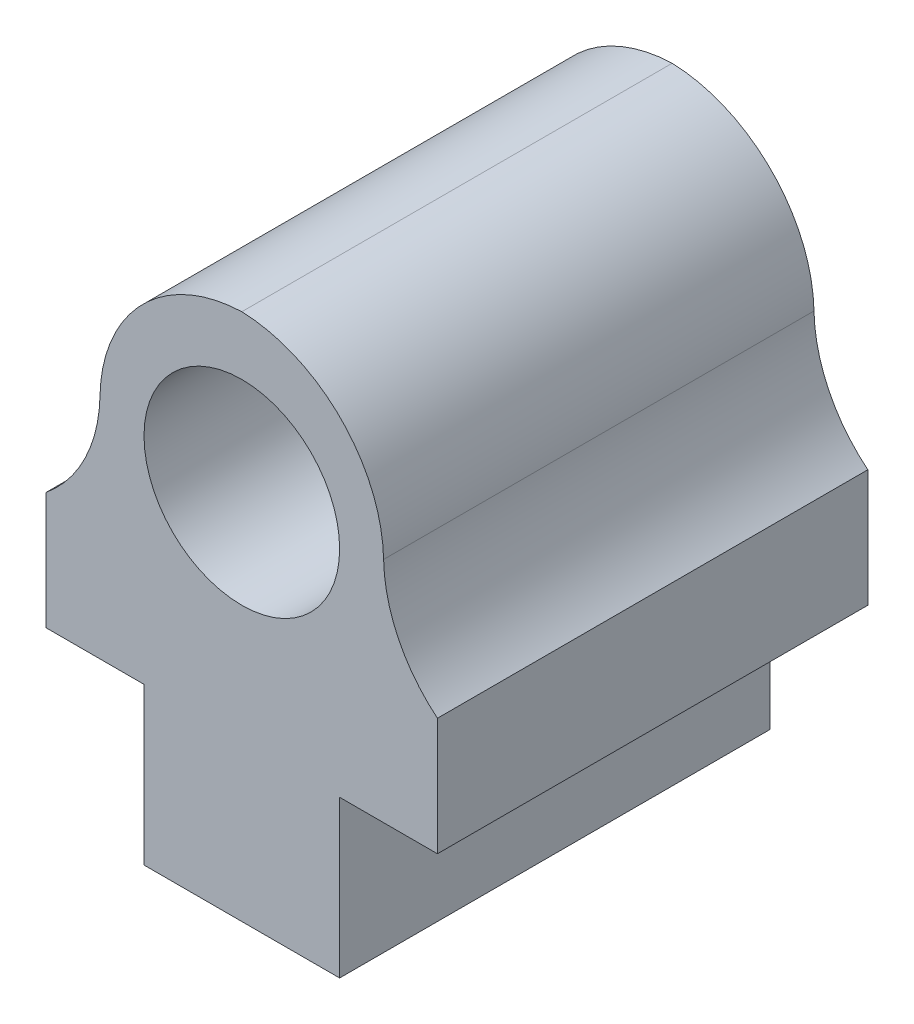
ISO-10303-21;
HEADER;
FILE_DESCRIPTION(('STEP AP214'),'2;1');
FILE_NAME('part.step','',(''),(''),'','','');
FILE_SCHEMA(('AUTOMOTIVE_DESIGN { 1 0 10303 214 1 1 1 1 }'));
ENDSEC;
DATA;
#1=APPLICATION_CONTEXT('core data for automotive mechanical design processes');
#2=APPLICATION_PROTOCOL_DEFINITION('international standard','automotive_design',2000,#1);
#3=PRODUCT_CONTEXT('',#1,'mechanical');
#4=PRODUCT('Part','Part','',(#3));
#5=PRODUCT_RELATED_PRODUCT_CATEGORY('part','',(#4));
#6=PRODUCT_DEFINITION_FORMATION('','',#4);
#7=PRODUCT_DEFINITION_CONTEXT('part definition',#1,'design');
#8=PRODUCT_DEFINITION('design','',#6,#7);
#9=PRODUCT_DEFINITION_SHAPE('','',#8);
#10=(LENGTH_UNIT() NAMED_UNIT(*) SI_UNIT(.MILLI.,.METRE.));
#11=(NAMED_UNIT(*) PLANE_ANGLE_UNIT() SI_UNIT($,.RADIAN.));
#12=(NAMED_UNIT(*) SI_UNIT($,.STERADIAN.) SOLID_ANGLE_UNIT());
#13=UNCERTAINTY_MEASURE_WITH_UNIT(LENGTH_MEASURE(1.E-05),#10,'distance_accuracy_value','');
#14=(GEOMETRIC_REPRESENTATION_CONTEXT(3) GLOBAL_UNCERTAINTY_ASSIGNED_CONTEXT((#13)) GLOBAL_UNIT_ASSIGNED_CONTEXT((#10,
#11,#12)) REPRESENTATION_CONTEXT('',''));
#15=CARTESIAN_POINT('',(0.,0.,0.));
#16=DIRECTION('',(0.,0.,1.));
#17=DIRECTION('',(1.,0.,0.));
#18=AXIS2_PLACEMENT_3D('',#15,#16,#17);
#19=CARTESIAN_POINT('',(0.,0.,0.));
#20=DIRECTION('',(0.,-1.,0.));
#21=DIRECTION('',(0.,0.,-1.));
#22=AXIS2_PLACEMENT_3D('',#19,#20,#21);
#23=PLANE('',#22);
#24=DIRECTION('',(0.,0.,-1.));
#25=VECTOR('',#24,1.);
#26=CARTESIAN_POINT('',(5.,0.,0.));
#27=LINE('',#26,#25);
#28=CARTESIAN_POINT('',(5.,0.,0.));
#29=VERTEX_POINT('',#28);
#30=CARTESIAN_POINT('',(5.,0.,-22.));
#31=VERTEX_POINT('',#30);
#32=EDGE_CURVE('E141',#29,#31,#27,.T.);
#33=ORIENTED_EDGE('',*,*,#32,.F.);
#34=DIRECTION('',(1.,0.,0.));
#35=VECTOR('',#34,1.);
#36=CARTESIAN_POINT('',(0.,0.,0.));
#37=LINE('',#36,#35);
#38=CARTESIAN_POINT('',(0.,0.,0.));
#39=VERTEX_POINT('',#38);
#40=EDGE_CURVE('E158',#39,#29,#37,.T.);
#41=ORIENTED_EDGE('',*,*,#40,.F.);
#42=DIRECTION('',(0.,0.,1.));
#43=VECTOR('',#42,1.);
#44=CARTESIAN_POINT('',(0.,0.,0.));
#45=LINE('',#44,#43);
#46=CARTESIAN_POINT('',(0.,0.,-22.));
#47=VERTEX_POINT('',#46);
#48=EDGE_CURVE('E142',#47,#39,#45,.T.);
#49=ORIENTED_EDGE('',*,*,#48,.F.);
#50=DIRECTION('',(-1.,0.,0.));
#51=VECTOR('',#50,1.);
#52=CARTESIAN_POINT('',(0.,0.,-22.));
#53=LINE('',#52,#51);
#54=EDGE_CURVE('E163',#31,#47,#53,.T.);
#55=ORIENTED_EDGE('',*,*,#54,.F.);
#56=EDGE_LOOP('',(#33,#41,#49,#55));
#57=FACE_BOUND('',#56,.T.);
#58=ADVANCED_FACE('F37',(#57),#23,.T.);
#59=CARTESIAN_POINT('',(0.,6.,0.));
#60=DIRECTION('',(1.,0.,0.));
#61=DIRECTION('',(0.,0.,-1.));
#62=AXIS2_PLACEMENT_3D('',#59,#60,#61);
#63=PLANE('',#62);
#64=ORIENTED_EDGE('',*,*,#48,.T.);
#65=DIRECTION('',(0.,-1.,0.));
#66=VECTOR('',#65,1.);
#67=CARTESIAN_POINT('',(0.,6.,0.));
#68=LINE('',#67,#66);
#69=CARTESIAN_POINT('',(0.,6.,0.));
#70=VERTEX_POINT('',#69);
#71=EDGE_CURVE('E173',#70,#39,#68,.T.);
#72=ORIENTED_EDGE('',*,*,#71,.F.);
#73=DIRECTION('',(0.,0.,1.));
#74=VECTOR('',#73,1.);
#75=CARTESIAN_POINT('',(0.,6.,0.));
#76=LINE('',#75,#74);
#77=CARTESIAN_POINT('',(0.,6.,-22.));
#78=VERTEX_POINT('',#77);
#79=EDGE_CURVE('E151',#78,#70,#76,.T.);
#80=ORIENTED_EDGE('',*,*,#79,.F.);
#81=DIRECTION('',(0.,-1.,0.));
#82=VECTOR('',#81,1.);
#83=CARTESIAN_POINT('',(0.,6.,-22.));
#84=LINE('',#83,#82);
#85=EDGE_CURVE('E156',#78,#47,#84,.T.);
#86=ORIENTED_EDGE('',*,*,#85,.T.);
#87=EDGE_LOOP('',(#64,#72,#80,#86));
#88=FACE_BOUND('',#87,.T.);
#89=ADVANCED_FACE('F204',(#88),#63,.F.);
#90=CARTESIAN_POINT('',(0.,6.,0.));
#91=DIRECTION('',(0.,0.,-1.));
#92=DIRECTION('',(-1.,0.,0.));
#93=AXIS2_PLACEMENT_3D('',#90,#91,#92);
#94=PLANE('',#93);
#95=CARTESIAN_POINT('',(10.,11.,0.));
#96=DIRECTION('',(0.,0.,1.));
#97=DIRECTION('',(1.,0.,0.));
#98=AXIS2_PLACEMENT_3D('',#95,#96,#97);
#99=CIRCLE('',#98,5.);
#100=CARTESIAN_POINT('',(15.,11.,0.));
#101=VERTEX_POINT('',#100);
#102=EDGE_CURVE('E190',#101,#101,#99,.T.);
#103=ORIENTED_EDGE('',*,*,#102,.F.);
#104=EDGE_LOOP('',(#103));
#105=FACE_BOUND('',#104,.T.);
#106=DIRECTION('',(0.,-1.,0.));
#107=VECTOR('',#106,1.);
#108=CARTESIAN_POINT('',(20.,6.,0.));
#109=LINE('',#108,#107);
#110=CARTESIAN_POINT('',(20.,6.,0.));
#111=VERTEX_POINT('',#110);
#112=CARTESIAN_POINT('',(20.,0.,0.));
#113=VERTEX_POINT('',#112);
#114=EDGE_CURVE('E170',#111,#113,#109,.T.);
#115=ORIENTED_EDGE('',*,*,#114,.F.);
#116=CARTESIAN_POINT('',(24.7468650433401,11.8066575807702,0.));
#117=DIRECTION('',(0.,0.,-1.));
#118=DIRECTION('',(-1.,0.,0.));
#119=AXIS2_PLACEMENT_3D('',#116,#117,#118);
#120=CIRCLE('',#119,7.5);
#121=CARTESIAN_POINT('',(17.2484325216701,11.6533287903851,0.));
#122=VERTEX_POINT('',#121);
#123=EDGE_CURVE('E197',#111,#122,#120,.T.);
#124=ORIENTED_EDGE('',*,*,#123,.T.);
#125=CARTESIAN_POINT('',(9.75000000000001,11.5,0.));
#126=DIRECTION('',(0.,0.,-1.));
#127=DIRECTION('',(-1.,0.,0.));
#128=AXIS2_PLACEMENT_3D('',#125,#126,#127);
#129=CIRCLE('',#128,7.5);
#130=CARTESIAN_POINT('',(10.,18.9958321752825,0.));
#131=VERTEX_POINT('',#130);
#132=EDGE_CURVE('E184',#122,#131,#129,.F.);
#133=ORIENTED_EDGE('',*,*,#132,.T.);
#134=CARTESIAN_POINT('',(10.25,11.5,0.));
#135=DIRECTION('',(0.,0.,-1.));
#136=DIRECTION('',(-1.,0.,0.));
#137=AXIS2_PLACEMENT_3D('',#134,#135,#136);
#138=CIRCLE('',#137,7.5);
#139=CARTESIAN_POINT('',(2.75156747832995,11.6533287903851,0.));
#140=VERTEX_POINT('',#139);
#141=EDGE_CURVE('E181',#131,#140,#138,.F.);
#142=ORIENTED_EDGE('',*,*,#141,.T.);
#143=CARTESIAN_POINT('',(-4.74686504334009,11.8066575807702,0.));
#144=DIRECTION('',(0.,0.,-1.));
#145=DIRECTION('',(-1.,0.,0.));
#146=AXIS2_PLACEMENT_3D('',#143,#144,#145);
#147=CIRCLE('',#146,7.5);
#148=EDGE_CURVE('E45',#140,#70,#147,.T.);
#149=ORIENTED_EDGE('',*,*,#148,.T.);
#150=ORIENTED_EDGE('',*,*,#71,.T.);
#151=ORIENTED_EDGE('',*,*,#40,.T.);
#152=DIRECTION('',(0.,1.,0.));
#153=VECTOR('',#152,1.);
#154=CARTESIAN_POINT('',(5.,-8.,0.));
#155=LINE('',#154,#153);
#156=CARTESIAN_POINT('',(5.,-8.,0.));
#157=VERTEX_POINT('',#156);
#158=EDGE_CURVE('E234',#157,#29,#155,.T.);
#159=ORIENTED_EDGE('',*,*,#158,.F.);
#160=DIRECTION('',(-1.,0.,0.));
#161=VECTOR('',#160,1.);
#162=CARTESIAN_POINT('',(5.,-8.,0.));
#163=LINE('',#162,#161);
#164=CARTESIAN_POINT('',(15.,-8.,0.));
#165=VERTEX_POINT('',#164);
#166=EDGE_CURVE('E134',#165,#157,#163,.T.);
#167=ORIENTED_EDGE('',*,*,#166,.F.);
#168=DIRECTION('',(0.,1.,0.));
#169=VECTOR('',#168,1.);
#170=CARTESIAN_POINT('',(15.,-8.,0.));
#171=LINE('',#170,#169);
#172=CARTESIAN_POINT('',(15.,0.,0.));
#173=VERTEX_POINT('',#172);
#174=EDGE_CURVE('E147',#165,#173,#171,.T.);
#175=ORIENTED_EDGE('',*,*,#174,.T.);
#176=EDGE_CURVE('E145',#173,#113,#37,.T.);
#177=ORIENTED_EDGE('',*,*,#176,.T.);
#178=EDGE_LOOP('',(#115,#124,#133,#142,#149,#150,#151,#159,#167,#175,#177));
#179=FACE_BOUND('',#178,.T.);
#180=ADVANCED_FACE('F200',(#105,#179),#94,.F.);
#181=CARTESIAN_POINT('',(20.,6.,0.));
#182=DIRECTION('',(-1.,0.,0.));
#183=DIRECTION('',(0.,0.,1.));
#184=AXIS2_PLACEMENT_3D('',#181,#182,#183);
#185=PLANE('',#184);
#186=DIRECTION('',(0.,0.,-1.));
#187=VECTOR('',#186,1.);
#188=CARTESIAN_POINT('',(20.,0.,0.));
#189=LINE('',#188,#187);
#190=CARTESIAN_POINT('',(20.,0.,-22.));
#191=VERTEX_POINT('',#190);
#192=EDGE_CURVE('E161',#113,#191,#189,.T.);
#193=ORIENTED_EDGE('',*,*,#192,.T.);
#194=DIRECTION('',(0.,-1.,0.));
#195=VECTOR('',#194,1.);
#196=CARTESIAN_POINT('',(20.,6.,-22.));
#197=LINE('',#196,#195);
#198=CARTESIAN_POINT('',(20.,6.,-22.));
#199=VERTEX_POINT('',#198);
#200=EDGE_CURVE('E167',#199,#191,#197,.T.);
#201=ORIENTED_EDGE('',*,*,#200,.F.);
#202=DIRECTION('',(0.,0.,-1.));
#203=VECTOR('',#202,1.);
#204=CARTESIAN_POINT('',(20.,6.,0.));
#205=LINE('',#204,#203);
#206=EDGE_CURVE('E153',#111,#199,#205,.T.);
#207=ORIENTED_EDGE('',*,*,#206,.F.);
#208=ORIENTED_EDGE('',*,*,#114,.T.);
#209=EDGE_LOOP('',(#193,#201,#207,#208));
#210=FACE_BOUND('',#209,.T.);
#211=ADVANCED_FACE('F220',(#210),#185,.F.);
#212=CARTESIAN_POINT('',(0.,6.,-22.));
#213=DIRECTION('',(0.,0.,1.));
#214=DIRECTION('',(1.,0.,0.));
#215=AXIS2_PLACEMENT_3D('',#212,#213,#214);
#216=PLANE('',#215);
#217=CARTESIAN_POINT('',(10.,11.,-22.));
#218=DIRECTION('',(0.,0.,1.));
#219=DIRECTION('',(1.,0.,0.));
#220=AXIS2_PLACEMENT_3D('',#217,#218,#219);
#221=CIRCLE('',#220,5.);
#222=CARTESIAN_POINT('',(15.,11.,-22.));
#223=VERTEX_POINT('',#222);
#224=EDGE_CURVE('E230',#223,#223,#221,.T.);
#225=ORIENTED_EDGE('',*,*,#224,.T.);
#226=EDGE_LOOP('',(#225));
#227=FACE_BOUND('',#226,.T.);
#228=ORIENTED_EDGE('',*,*,#85,.F.);
#229=CARTESIAN_POINT('',(-4.7468650433401,11.8066575807702,-22.));
#230=DIRECTION('',(0.,0.,1.));
#231=DIRECTION('',(1.,0.,0.));
#232=AXIS2_PLACEMENT_3D('',#229,#230,#231);
#233=CIRCLE('',#232,7.5);
#234=CARTESIAN_POINT('',(2.75156747832995,11.6533287903851,-22.));
#235=VERTEX_POINT('',#234);
#236=EDGE_CURVE('E11',#78,#235,#233,.T.);
#237=ORIENTED_EDGE('',*,*,#236,.T.);
#238=CARTESIAN_POINT('',(10.25,11.5,-22.));
#239=DIRECTION('',(0.,0.,1.));
#240=DIRECTION('',(1.,0.,0.));
#241=AXIS2_PLACEMENT_3D('',#238,#239,#240);
#242=CIRCLE('',#241,7.5);
#243=CARTESIAN_POINT('',(10.,18.9958321752825,-22.));
#244=VERTEX_POINT('',#243);
#245=EDGE_CURVE('E176',#235,#244,#242,.F.);
#246=ORIENTED_EDGE('',*,*,#245,.T.);
#247=CARTESIAN_POINT('',(9.75,11.5,-22.));
#248=DIRECTION('',(0.,0.,1.));
#249=DIRECTION('',(1.,0.,0.));
#250=AXIS2_PLACEMENT_3D('',#247,#248,#249);
#251=CIRCLE('',#250,7.5);
#252=CARTESIAN_POINT('',(17.24843252167,11.6533287903851,-22.));
#253=VERTEX_POINT('',#252);
#254=EDGE_CURVE('E178',#244,#253,#251,.F.);
#255=ORIENTED_EDGE('',*,*,#254,.T.);
#256=CARTESIAN_POINT('',(24.7468650433401,11.8066575807702,-22.));
#257=DIRECTION('',(0.,0.,1.));
#258=DIRECTION('',(1.,0.,0.));
#259=AXIS2_PLACEMENT_3D('',#256,#257,#258);
#260=CIRCLE('',#259,7.5);
#261=EDGE_CURVE('E195',#253,#199,#260,.T.);
#262=ORIENTED_EDGE('',*,*,#261,.T.);
#263=ORIENTED_EDGE('',*,*,#200,.T.);
#264=CARTESIAN_POINT('',(15.,0.,-22.));
#265=VERTEX_POINT('',#264);
#266=EDGE_CURVE('E154',#191,#265,#53,.T.);
#267=ORIENTED_EDGE('',*,*,#266,.T.);
#268=DIRECTION('',(0.,1.,0.));
#269=VECTOR('',#268,1.);
#270=CARTESIAN_POINT('',(15.,-8.,-22.));
#271=LINE('',#270,#269);
#272=CARTESIAN_POINT('',(15.,-8.,-22.));
#273=VERTEX_POINT('',#272);
#274=EDGE_CURVE('E125',#273,#265,#271,.T.);
#275=ORIENTED_EDGE('',*,*,#274,.F.);
#276=DIRECTION('',(1.,0.,0.));
#277=VECTOR('',#276,1.);
#278=CARTESIAN_POINT('',(5.,-8.,-22.));
#279=LINE('',#278,#277);
#280=CARTESIAN_POINT('',(5.,-8.,-22.));
#281=VERTEX_POINT('',#280);
#282=EDGE_CURVE('E117',#281,#273,#279,.T.);
#283=ORIENTED_EDGE('',*,*,#282,.F.);
#284=DIRECTION('',(0.,1.,0.));
#285=VECTOR('',#284,1.);
#286=CARTESIAN_POINT('',(5.,-8.,-22.));
#287=LINE('',#286,#285);
#288=EDGE_CURVE('E121',#281,#31,#287,.T.);
#289=ORIENTED_EDGE('',*,*,#288,.T.);
#290=ORIENTED_EDGE('',*,*,#54,.T.);
#291=EDGE_LOOP('',(#228,#237,#246,#255,#262,#263,#267,#275,#283,#289,#290));
#292=FACE_BOUND('',#291,.T.);
#293=ADVANCED_FACE('F119',(#227,#292),#216,.F.);
#294=DIRECTION('',(0.,0.,1.));
#295=VECTOR('',#294,1.);
#296=CARTESIAN_POINT('',(15.,0.,0.));
#297=LINE('',#296,#295);
#298=EDGE_CURVE('E138',#265,#173,#297,.T.);
#299=ORIENTED_EDGE('',*,*,#298,.F.);
#300=ORIENTED_EDGE('',*,*,#266,.F.);
#301=ORIENTED_EDGE('',*,*,#192,.F.);
#302=ORIENTED_EDGE('',*,*,#176,.F.);
#303=EDGE_LOOP('',(#299,#300,#301,#302));
#304=FACE_BOUND('',#303,.T.);
#305=ADVANCED_FACE('F224',(#304),#23,.T.);
#306=CARTESIAN_POINT('',(5.,-8.,0.));
#307=DIRECTION('',(1.,0.,0.));
#308=DIRECTION('',(0.,0.,-1.));
#309=AXIS2_PLACEMENT_3D('',#306,#307,#308);
#310=PLANE('',#309);
#311=ORIENTED_EDGE('',*,*,#32,.T.);
#312=ORIENTED_EDGE('',*,*,#288,.F.);
#313=DIRECTION('',(0.,0.,-1.));
#314=VECTOR('',#313,1.);
#315=CARTESIAN_POINT('',(5.,-8.,0.));
#316=LINE('',#315,#314);
#317=EDGE_CURVE('E129',#157,#281,#316,.T.);
#318=ORIENTED_EDGE('',*,*,#317,.F.);
#319=ORIENTED_EDGE('',*,*,#158,.T.);
#320=EDGE_LOOP('',(#311,#312,#318,#319));
#321=FACE_BOUND('',#320,.T.);
#322=ADVANCED_FACE('F140',(#321),#310,.F.);
#323=CARTESIAN_POINT('',(15.,-8.,0.));
#324=DIRECTION('',(-1.,0.,0.));
#325=DIRECTION('',(0.,0.,1.));
#326=AXIS2_PLACEMENT_3D('',#323,#324,#325);
#327=PLANE('',#326);
#328=ORIENTED_EDGE('',*,*,#298,.T.);
#329=ORIENTED_EDGE('',*,*,#174,.F.);
#330=DIRECTION('',(0.,0.,1.));
#331=VECTOR('',#330,1.);
#332=CARTESIAN_POINT('',(15.,-8.,0.));
#333=LINE('',#332,#331);
#334=EDGE_CURVE('E128',#273,#165,#333,.T.);
#335=ORIENTED_EDGE('',*,*,#334,.F.);
#336=ORIENTED_EDGE('',*,*,#274,.T.);
#337=EDGE_LOOP('',(#328,#329,#335,#336));
#338=FACE_BOUND('',#337,.T.);
#339=ADVANCED_FACE('F235',(#338),#327,.F.);
#340=CARTESIAN_POINT('',(0.,-8.,0.));
#341=DIRECTION('',(0.,-1.,0.));
#342=DIRECTION('',(0.,0.,-1.));
#343=AXIS2_PLACEMENT_3D('',#340,#341,#342);
#344=PLANE('',#343);
#345=ORIENTED_EDGE('',*,*,#317,.T.);
#346=ORIENTED_EDGE('',*,*,#282,.T.);
#347=ORIENTED_EDGE('',*,*,#334,.T.);
#348=ORIENTED_EDGE('',*,*,#166,.T.);
#349=EDGE_LOOP('',(#345,#346,#347,#348));
#350=FACE_BOUND('',#349,.T.);
#351=ADVANCED_FACE('F132',(#350),#344,.T.);
#352=CARTESIAN_POINT('',(10.,11.,-22.));
#353=DIRECTION('',(0.,0.,1.));
#354=DIRECTION('',(1.,0.,0.));
#355=AXIS2_PLACEMENT_3D('',#352,#353,#354);
#356=CYLINDRICAL_SURFACE('',#355,5.);
#357=ORIENTED_EDGE('',*,*,#224,.F.);
#358=EDGE_LOOP('',(#357));
#359=FACE_BOUND('',#358,.T.);
#360=ORIENTED_EDGE('',*,*,#102,.T.);
#361=EDGE_LOOP('',(#360));
#362=FACE_BOUND('',#361,.T.);
#363=ADVANCED_FACE('F244',(#359,#362),#356,.F.);
#364=CARTESIAN_POINT('',(10.25,11.5,0.));
#365=DIRECTION('',(0.,0.,-1.));
#366=DIRECTION('',(-1.,0.,0.));
#367=AXIS2_PLACEMENT_3D('',#364,#365,#366);
#368=CYLINDRICAL_SURFACE('',#367,7.5);
#369=ORIENTED_EDGE('',*,*,#245,.F.);
#370=DIRECTION('',(0.,0.,-1.));
#371=VECTOR('',#370,1.);
#372=CARTESIAN_POINT('',(2.75156747832995,11.6533287903851,0.));
#373=LINE('',#372,#371);
#374=EDGE_CURVE('E193',#235,#140,#373,.F.);
#375=ORIENTED_EDGE('',*,*,#374,.T.);
#376=ORIENTED_EDGE('',*,*,#141,.F.);
#377=DIRECTION('',(0.,0.,-1.));
#378=VECTOR('',#377,1.);
#379=CARTESIAN_POINT('',(10.,18.9958321752825,-11.));
#380=LINE('',#379,#378);
#381=EDGE_CURVE('E187',#244,#131,#380,.F.);
#382=ORIENTED_EDGE('',*,*,#381,.F.);
#383=EDGE_LOOP('',(#369,#375,#376,#382));
#384=FACE_BOUND('',#383,.T.);
#385=ADVANCED_FACE('F207',(#384),#368,.T.);
#386=CARTESIAN_POINT('',(9.75000000000001,11.5,0.));
#387=DIRECTION('',(0.,0.,1.));
#388=DIRECTION('',(1.,0.,0.));
#389=AXIS2_PLACEMENT_3D('',#386,#387,#388);
#390=CYLINDRICAL_SURFACE('',#389,7.5);
#391=ORIENTED_EDGE('',*,*,#132,.F.);
#392=DIRECTION('',(0.,0.,1.));
#393=VECTOR('',#392,1.);
#394=CARTESIAN_POINT('',(17.2484325216701,11.6533287903851,0.));
#395=LINE('',#394,#393);
#396=EDGE_CURVE('E186',#122,#253,#395,.F.);
#397=ORIENTED_EDGE('',*,*,#396,.T.);
#398=ORIENTED_EDGE('',*,*,#254,.F.);
#399=ORIENTED_EDGE('',*,*,#381,.T.);
#400=EDGE_LOOP('',(#391,#397,#398,#399));
#401=FACE_BOUND('',#400,.T.);
#402=ADVANCED_FACE('F213',(#401),#390,.T.);
#403=CARTESIAN_POINT('',(24.7468650433401,11.8066575807702,0.));
#404=DIRECTION('',(0.,0.,1.));
#405=DIRECTION('',(1.,0.,0.));
#406=AXIS2_PLACEMENT_3D('',#403,#404,#405);
#407=CYLINDRICAL_SURFACE('',#406,7.5);
#408=ORIENTED_EDGE('',*,*,#123,.F.);
#409=ORIENTED_EDGE('',*,*,#206,.T.);
#410=ORIENTED_EDGE('',*,*,#261,.F.);
#411=ORIENTED_EDGE('',*,*,#396,.F.);
#412=EDGE_LOOP('',(#408,#409,#410,#411));
#413=FACE_BOUND('',#412,.T.);
#414=ADVANCED_FACE('F217',(#413),#407,.F.);
#415=CARTESIAN_POINT('',(-4.74686504334009,11.8066575807702,0.));
#416=DIRECTION('',(0.,0.,-1.));
#417=DIRECTION('',(-1.,0.,0.));
#418=AXIS2_PLACEMENT_3D('',#415,#416,#417);
#419=CYLINDRICAL_SURFACE('',#418,7.5);
#420=ORIENTED_EDGE('',*,*,#236,.F.);
#421=ORIENTED_EDGE('',*,*,#79,.T.);
#422=ORIENTED_EDGE('',*,*,#148,.F.);
#423=ORIENTED_EDGE('',*,*,#374,.F.);
#424=EDGE_LOOP('',(#420,#421,#422,#423));
#425=FACE_BOUND('',#424,.T.);
#426=ADVANCED_FACE('F39',(#425),#419,.F.);
#427=CLOSED_SHELL('',(#58,#89,#180,#211,#293,#305,#322,#339,#351,#363,#385,#402,#414,#426));
#428=MANIFOLD_SOLID_BREP('B2',#427);
#429=ADVANCED_BREP_SHAPE_REPRESENTATION('',(#18,#428),#14);
#430=SHAPE_DEFINITION_REPRESENTATION(#9,#429);
ENDSEC;
END-ISO-10303-21;
